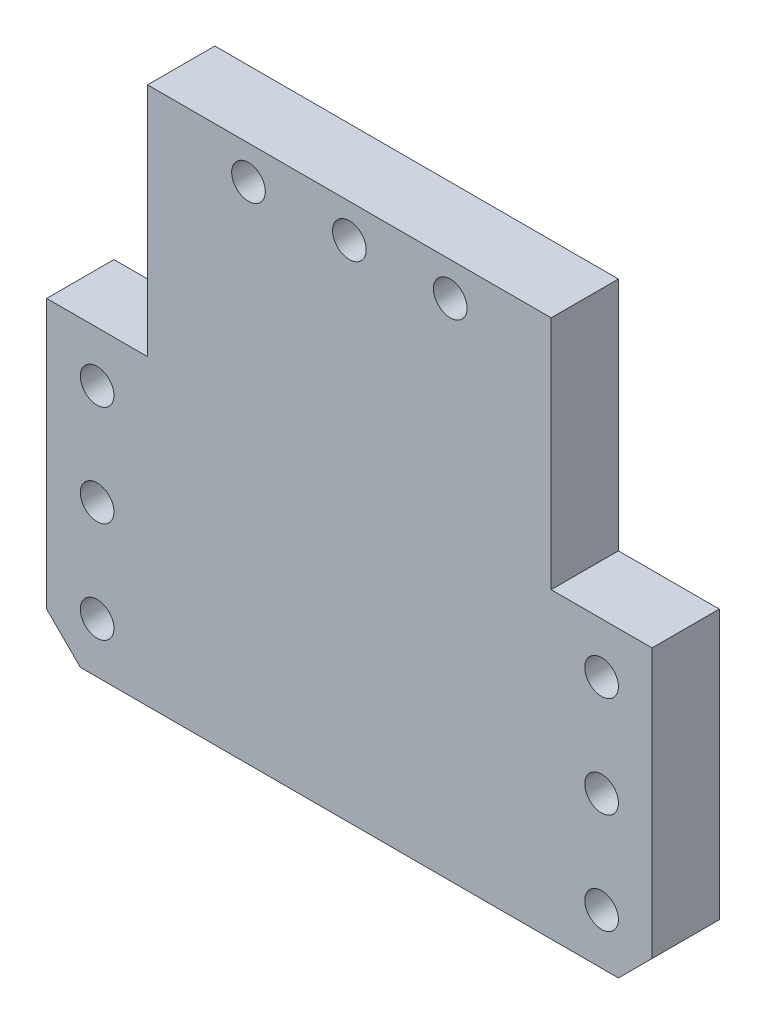
ISO-10303-21;
HEADER;
FILE_DESCRIPTION(('STEP AP214'),'2;1');
FILE_NAME('part.step','',(''),(''),'','','');
FILE_SCHEMA(('AUTOMOTIVE_DESIGN { 1 0 10303 214 1 1 1 1 }'));
ENDSEC;
DATA;
#1=APPLICATION_CONTEXT('core data for automotive mechanical design processes');
#2=APPLICATION_PROTOCOL_DEFINITION('international standard','automotive_design',2000,#1);
#3=PRODUCT_CONTEXT('',#1,'mechanical');
#4=PRODUCT('Part','Part','',(#3));
#5=PRODUCT_RELATED_PRODUCT_CATEGORY('part','',(#4));
#6=PRODUCT_DEFINITION_FORMATION('','',#4);
#7=PRODUCT_DEFINITION_CONTEXT('part definition',#1,'design');
#8=PRODUCT_DEFINITION('design','',#6,#7);
#9=PRODUCT_DEFINITION_SHAPE('','',#8);
#10=(LENGTH_UNIT() NAMED_UNIT(*) SI_UNIT(.MILLI.,.METRE.));
#11=(NAMED_UNIT(*) PLANE_ANGLE_UNIT() SI_UNIT($,.RADIAN.));
#12=(NAMED_UNIT(*) SI_UNIT($,.STERADIAN.) SOLID_ANGLE_UNIT());
#13=UNCERTAINTY_MEASURE_WITH_UNIT(LENGTH_MEASURE(1.E-05),#10,'distance_accuracy_value','');
#14=(GEOMETRIC_REPRESENTATION_CONTEXT(3) GLOBAL_UNCERTAINTY_ASSIGNED_CONTEXT((#13)) GLOBAL_UNIT_ASSIGNED_CONTEXT((#10,
#11,#12)) REPRESENTATION_CONTEXT('',''));
#15=CARTESIAN_POINT('',(0.,0.,0.));
#16=DIRECTION('',(0.,0.,1.));
#17=DIRECTION('',(1.,0.,0.));
#18=AXIS2_PLACEMENT_3D('',#15,#16,#17);
#19=CARTESIAN_POINT('',(60.,0.,10.));
#20=DIRECTION('',(-1.,0.,0.));
#21=DIRECTION('',(0.,0.,1.));
#22=AXIS2_PLACEMENT_3D('',#19,#20,#21);
#23=PLANE('',#22);
#24=DIRECTION('',(0.,0.,1.));
#25=VECTOR('',#24,1.);
#26=CARTESIAN_POINT('',(60.,45.,0.));
#27=LINE('',#26,#25);
#28=CARTESIAN_POINT('',(60.,45.,0.));
#29=VERTEX_POINT('',#28);
#30=CARTESIAN_POINT('',(60.,45.,10.));
#31=VERTEX_POINT('',#30);
#32=EDGE_CURVE('E126',#29,#31,#27,.T.);
#33=ORIENTED_EDGE('',*,*,#32,.F.);
#34=DIRECTION('',(0.,1.,0.));
#35=VECTOR('',#34,1.);
#36=CARTESIAN_POINT('',(60.,0.,0.));
#37=LINE('',#36,#35);
#38=CARTESIAN_POINT('',(60.,80.,0.));
#39=VERTEX_POINT('',#38);
#40=EDGE_CURVE('E131',#29,#39,#37,.T.);
#41=ORIENTED_EDGE('',*,*,#40,.T.);
#42=DIRECTION('',(0.,0.,-1.));
#43=VECTOR('',#42,1.);
#44=CARTESIAN_POINT('',(60.,80.,10.));
#45=LINE('',#44,#43);
#46=CARTESIAN_POINT('',(60.,80.,10.));
#47=VERTEX_POINT('',#46);
#48=EDGE_CURVE('E178',#47,#39,#45,.T.);
#49=ORIENTED_EDGE('',*,*,#48,.F.);
#50=DIRECTION('',(0.,1.,0.));
#51=VECTOR('',#50,1.);
#52=CARTESIAN_POINT('',(60.,0.,10.));
#53=LINE('',#52,#51);
#54=EDGE_CURVE('E164',#31,#47,#53,.T.);
#55=ORIENTED_EDGE('',*,*,#54,.F.);
#56=EDGE_LOOP('',(#33,#41,#49,#55));
#57=FACE_BOUND('',#56,.T.);
#58=ADVANCED_FACE('F33',(#57),#23,.F.);
#59=CARTESIAN_POINT('',(0.,0.,10.));
#60=DIRECTION('',(1.,0.,0.));
#61=DIRECTION('',(0.,0.,-1.));
#62=AXIS2_PLACEMENT_3D('',#59,#60,#61);
#63=PLANE('',#62);
#64=DIRECTION('',(0.,-1.,0.));
#65=VECTOR('',#64,1.);
#66=CARTESIAN_POINT('',(0.,0.,0.));
#67=LINE('',#66,#65);
#68=CARTESIAN_POINT('',(0.,80.,0.));
#69=VERTEX_POINT('',#68);
#70=CARTESIAN_POINT('',(0.,45.,0.));
#71=VERTEX_POINT('',#70);
#72=EDGE_CURVE('E154',#69,#71,#67,.T.);
#73=ORIENTED_EDGE('',*,*,#72,.T.);
#74=DIRECTION('',(0.,0.,1.));
#75=VECTOR('',#74,1.);
#76=CARTESIAN_POINT('',(0.,45.,0.));
#77=LINE('',#76,#75);
#78=CARTESIAN_POINT('',(0.,45.,10.));
#79=VERTEX_POINT('',#78);
#80=EDGE_CURVE('E147',#71,#79,#77,.T.);
#81=ORIENTED_EDGE('',*,*,#80,.T.);
#82=DIRECTION('',(0.,-1.,0.));
#83=VECTOR('',#82,1.);
#84=CARTESIAN_POINT('',(0.,0.,10.));
#85=LINE('',#84,#83);
#86=CARTESIAN_POINT('',(0.,80.,10.));
#87=VERTEX_POINT('',#86);
#88=EDGE_CURVE('E157',#87,#79,#85,.T.);
#89=ORIENTED_EDGE('',*,*,#88,.F.);
#90=DIRECTION('',(0.,0.,-1.));
#91=VECTOR('',#90,1.);
#92=CARTESIAN_POINT('',(0.,80.,10.));
#93=LINE('',#92,#91);
#94=EDGE_CURVE('E168',#87,#69,#93,.T.);
#95=ORIENTED_EDGE('',*,*,#94,.T.);
#96=EDGE_LOOP('',(#73,#81,#89,#95));
#97=FACE_BOUND('',#96,.T.);
#98=ADVANCED_FACE('F210',(#97),#63,.F.);
#99=CARTESIAN_POINT('',(0.,0.,10.));
#100=DIRECTION('',(0.,1.,0.));
#101=DIRECTION('',(0.,0.,1.));
#102=AXIS2_PLACEMENT_3D('',#99,#100,#101);
#103=PLANE('',#102);
#104=DIRECTION('',(1.,0.,0.));
#105=VECTOR('',#104,1.);
#106=CARTESIAN_POINT('',(0.,0.,0.));
#107=LINE('',#106,#105);
#108=CARTESIAN_POINT('',(-9.99999999999999,0.,0.));
#109=VERTEX_POINT('',#108);
#110=CARTESIAN_POINT('',(70.,0.,0.));
#111=VERTEX_POINT('',#110);
#112=EDGE_CURVE('E171',#109,#111,#107,.T.);
#113=ORIENTED_EDGE('',*,*,#112,.T.);
#114=DIRECTION('',(0.,0.,1.));
#115=VECTOR('',#114,1.);
#116=CARTESIAN_POINT('',(70.,0.,10.));
#117=LINE('',#116,#115);
#118=CARTESIAN_POINT('',(70.,0.,10.));
#119=VERTEX_POINT('',#118);
#120=EDGE_CURVE('E183',#111,#119,#117,.T.);
#121=ORIENTED_EDGE('',*,*,#120,.T.);
#122=DIRECTION('',(1.,0.,0.));
#123=VECTOR('',#122,1.);
#124=CARTESIAN_POINT('',(0.,0.,10.));
#125=LINE('',#124,#123);
#126=CARTESIAN_POINT('',(-9.99999999999999,0.,10.));
#127=VERTEX_POINT('',#126);
#128=EDGE_CURVE('E160',#127,#119,#125,.T.);
#129=ORIENTED_EDGE('',*,*,#128,.F.);
#130=DIRECTION('',(0.,0.,-1.));
#131=VECTOR('',#130,1.);
#132=CARTESIAN_POINT('',(-9.99999999999999,0.,0.));
#133=LINE('',#132,#131);
#134=EDGE_CURVE('E181',#127,#109,#133,.T.);
#135=ORIENTED_EDGE('',*,*,#134,.T.);
#136=EDGE_LOOP('',(#113,#121,#129,#135));
#137=FACE_BOUND('',#136,.T.);
#138=ADVANCED_FACE('F194',(#137),#103,.F.);
#139=CARTESIAN_POINT('',(0.,80.,10.));
#140=DIRECTION('',(0.,-1.,0.));
#141=DIRECTION('',(0.,0.,-1.));
#142=AXIS2_PLACEMENT_3D('',#139,#140,#141);
#143=PLANE('',#142);
#144=DIRECTION('',(-1.,0.,0.));
#145=VECTOR('',#144,1.);
#146=CARTESIAN_POINT('',(0.,80.,0.));
#147=LINE('',#146,#145);
#148=EDGE_CURVE('E161',#39,#69,#147,.T.);
#149=ORIENTED_EDGE('',*,*,#148,.T.);
#150=ORIENTED_EDGE('',*,*,#94,.F.);
#151=DIRECTION('',(-1.,0.,0.));
#152=VECTOR('',#151,1.);
#153=CARTESIAN_POINT('',(0.,80.,10.));
#154=LINE('',#153,#152);
#155=EDGE_CURVE('E166',#47,#87,#154,.T.);
#156=ORIENTED_EDGE('',*,*,#155,.F.);
#157=ORIENTED_EDGE('',*,*,#48,.T.);
#158=EDGE_LOOP('',(#149,#150,#156,#157));
#159=FACE_BOUND('',#158,.T.);
#160=ADVANCED_FACE('F214',(#159),#143,.F.);
#161=CARTESIAN_POINT('',(0.,0.,10.));
#162=DIRECTION('',(0.,0.,-1.));
#163=DIRECTION('',(-1.,0.,0.));
#164=AXIS2_PLACEMENT_3D('',#161,#162,#163);
#165=PLANE('',#164);
#166=CARTESIAN_POINT('',(67.5,22.5,10.));
#167=DIRECTION('',(0.,0.,1.));
#168=DIRECTION('',(-1.,0.,0.));
#169=AXIS2_PLACEMENT_3D('',#166,#167,#168);
#170=CIRCLE('',#169,2.50000000000001);
#171=CARTESIAN_POINT('',(65.,22.5,10.));
#172=VERTEX_POINT('',#171);
#173=EDGE_CURVE('E336',#172,#172,#170,.T.);
#174=ORIENTED_EDGE('',*,*,#173,.F.);
#175=EDGE_LOOP('',(#174));
#176=FACE_BOUND('',#175,.T.);
#177=CARTESIAN_POINT('',(67.5,37.5,10.));
#178=DIRECTION('',(0.,0.,1.));
#179=DIRECTION('',(-1.,0.,0.));
#180=AXIS2_PLACEMENT_3D('',#177,#178,#179);
#181=CIRCLE('',#180,2.5);
#182=CARTESIAN_POINT('',(65.,37.5,10.));
#183=VERTEX_POINT('',#182);
#184=EDGE_CURVE('E340',#183,#183,#181,.T.);
#185=ORIENTED_EDGE('',*,*,#184,.F.);
#186=EDGE_LOOP('',(#185));
#187=FACE_BOUND('',#186,.T.);
#188=CARTESIAN_POINT('',(67.5,7.50000000000002,10.));
#189=DIRECTION('',(0.,0.,1.));
#190=DIRECTION('',(1.,0.,0.));
#191=AXIS2_PLACEMENT_3D('',#188,#189,#190);
#192=CIRCLE('',#191,2.50000000000001);
#193=CARTESIAN_POINT('',(70.,7.50000000000002,10.));
#194=VERTEX_POINT('',#193);
#195=EDGE_CURVE('E344',#194,#194,#192,.T.);
#196=ORIENTED_EDGE('',*,*,#195,.F.);
#197=EDGE_LOOP('',(#196));
#198=FACE_BOUND('',#197,.T.);
#199=CARTESIAN_POINT('',(-7.5,7.5,10.));
#200=DIRECTION('',(0.,0.,1.));
#201=DIRECTION('',(-1.,0.,0.));
#202=AXIS2_PLACEMENT_3D('',#199,#200,#201);
#203=CIRCLE('',#202,2.5);
#204=CARTESIAN_POINT('',(-10.,7.5,10.));
#205=VERTEX_POINT('',#204);
#206=EDGE_CURVE('E348',#205,#205,#203,.T.);
#207=ORIENTED_EDGE('',*,*,#206,.F.);
#208=EDGE_LOOP('',(#207));
#209=FACE_BOUND('',#208,.T.);
#210=CARTESIAN_POINT('',(-7.5,37.5,10.));
#211=DIRECTION('',(0.,0.,1.));
#212=DIRECTION('',(1.,0.,0.));
#213=AXIS2_PLACEMENT_3D('',#210,#211,#212);
#214=CIRCLE('',#213,2.5);
#215=CARTESIAN_POINT('',(-5.,37.5,10.));
#216=VERTEX_POINT('',#215);
#217=EDGE_CURVE('E320',#216,#216,#214,.T.);
#218=ORIENTED_EDGE('',*,*,#217,.F.);
#219=EDGE_LOOP('',(#218));
#220=FACE_BOUND('',#219,.T.);
#221=CARTESIAN_POINT('',(-7.5,22.5,10.));
#222=DIRECTION('',(0.,0.,1.));
#223=DIRECTION('',(1.,0.,0.));
#224=AXIS2_PLACEMENT_3D('',#221,#222,#223);
#225=CIRCLE('',#224,2.5);
#226=CARTESIAN_POINT('',(-5.,22.5,10.));
#227=VERTEX_POINT('',#226);
#228=EDGE_CURVE('E324',#227,#227,#225,.T.);
#229=ORIENTED_EDGE('',*,*,#228,.F.);
#230=EDGE_LOOP('',(#229));
#231=FACE_BOUND('',#230,.T.);
#232=CARTESIAN_POINT('',(15.,75.,10.));
#233=DIRECTION('',(0.,0.,1.));
#234=DIRECTION('',(-1.,0.,0.));
#235=AXIS2_PLACEMENT_3D('',#232,#233,#234);
#236=CIRCLE('',#235,2.5);
#237=CARTESIAN_POINT('',(12.5,75.,10.));
#238=VERTEX_POINT('',#237);
#239=EDGE_CURVE('E328',#238,#238,#236,.T.);
#240=ORIENTED_EDGE('',*,*,#239,.F.);
#241=EDGE_LOOP('',(#240));
#242=FACE_BOUND('',#241,.T.);
#243=CARTESIAN_POINT('',(30.,75.,10.));
#244=DIRECTION('',(0.,0.,1.));
#245=DIRECTION('',(1.,0.,0.));
#246=AXIS2_PLACEMENT_3D('',#243,#244,#245);
#247=CIRCLE('',#246,2.5);
#248=CARTESIAN_POINT('',(32.5,75.,10.));
#249=VERTEX_POINT('',#248);
#250=EDGE_CURVE('E332',#249,#249,#247,.T.);
#251=ORIENTED_EDGE('',*,*,#250,.F.);
#252=EDGE_LOOP('',(#251));
#253=FACE_BOUND('',#252,.T.);
#254=CARTESIAN_POINT('',(45.,75.,10.));
#255=DIRECTION('',(0.,0.,1.));
#256=DIRECTION('',(1.,0.,0.));
#257=AXIS2_PLACEMENT_3D('',#254,#255,#256);
#258=CIRCLE('',#257,2.5);
#259=CARTESIAN_POINT('',(47.5,75.,10.));
#260=VERTEX_POINT('',#259);
#261=EDGE_CURVE('E316',#260,#260,#258,.T.);
#262=ORIENTED_EDGE('',*,*,#261,.F.);
#263=EDGE_LOOP('',(#262));
#264=FACE_BOUND('',#263,.T.);
#265=ORIENTED_EDGE('',*,*,#128,.T.);
#266=DIRECTION('',(0.707106781186548,0.707106781186548,0.));
#267=VECTOR('',#266,1.);
#268=CARTESIAN_POINT('',(70.,0.,10.));
#269=LINE('',#268,#267);
#270=CARTESIAN_POINT('',(75.,5.,10.));
#271=VERTEX_POINT('',#270);
#272=EDGE_CURVE('E188',#119,#271,#269,.T.);
#273=ORIENTED_EDGE('',*,*,#272,.T.);
#274=DIRECTION('',(0.,1.,0.));
#275=VECTOR('',#274,1.);
#276=CARTESIAN_POINT('',(75.,0.,10.));
#277=LINE('',#276,#275);
#278=CARTESIAN_POINT('',(75.,45.,10.));
#279=VERTEX_POINT('',#278);
#280=EDGE_CURVE('E135',#271,#279,#277,.T.);
#281=ORIENTED_EDGE('',*,*,#280,.T.);
#282=DIRECTION('',(-1.,0.,0.));
#283=VECTOR('',#282,1.);
#284=CARTESIAN_POINT('',(60.,45.,10.));
#285=LINE('',#284,#283);
#286=EDGE_CURVE('E119',#279,#31,#285,.T.);
#287=ORIENTED_EDGE('',*,*,#286,.T.);
#288=ORIENTED_EDGE('',*,*,#54,.T.);
#289=ORIENTED_EDGE('',*,*,#155,.T.);
#290=ORIENTED_EDGE('',*,*,#88,.T.);
#291=DIRECTION('',(-1.,0.,0.));
#292=VECTOR('',#291,1.);
#293=CARTESIAN_POINT('',(0.,45.,10.));
#294=LINE('',#293,#292);
#295=CARTESIAN_POINT('',(-15.,45.,10.));
#296=VERTEX_POINT('',#295);
#297=EDGE_CURVE('E139',#79,#296,#294,.T.);
#298=ORIENTED_EDGE('',*,*,#297,.T.);
#299=DIRECTION('',(0.,-1.,0.));
#300=VECTOR('',#299,1.);
#301=CARTESIAN_POINT('',(-15.,0.,10.));
#302=LINE('',#301,#300);
#303=CARTESIAN_POINT('',(-15.,5.,10.));
#304=VERTEX_POINT('',#303);
#305=EDGE_CURVE('E145',#296,#304,#302,.T.);
#306=ORIENTED_EDGE('',*,*,#305,.T.);
#307=DIRECTION('',(0.707106781186548,-0.707106781186548,0.));
#308=VECTOR('',#307,1.);
#309=CARTESIAN_POINT('',(-15.,5.,10.));
#310=LINE('',#309,#308);
#311=EDGE_CURVE('E186',#304,#127,#310,.T.);
#312=ORIENTED_EDGE('',*,*,#311,.T.);
#313=EDGE_LOOP('',(#265,#273,#281,#287,#288,#289,#290,#298,#306,#312));
#314=FACE_BOUND('',#313,.T.);
#315=ADVANCED_FACE('F199',(#176,#187,#198,#209,#220,#231,#242,#253,#264,#314),#165,.F.);
#316=CARTESIAN_POINT('',(0.,0.,0.));
#317=DIRECTION('',(0.,0.,-1.));
#318=DIRECTION('',(-1.,0.,0.));
#319=AXIS2_PLACEMENT_3D('',#316,#317,#318);
#320=PLANE('',#319);
#321=CARTESIAN_POINT('',(67.5,22.5,0.));
#322=DIRECTION('',(0.,0.,1.));
#323=DIRECTION('',(-1.,0.,0.));
#324=AXIS2_PLACEMENT_3D('',#321,#322,#323);
#325=CIRCLE('',#324,2.50000000000001);
#326=CARTESIAN_POINT('',(65.,22.5,0.));
#327=VERTEX_POINT('',#326);
#328=EDGE_CURVE('E285',#327,#327,#325,.T.);
#329=ORIENTED_EDGE('',*,*,#328,.T.);
#330=EDGE_LOOP('',(#329));
#331=FACE_BOUND('',#330,.T.);
#332=CARTESIAN_POINT('',(67.5,37.5,0.));
#333=DIRECTION('',(0.,0.,1.));
#334=DIRECTION('',(-1.,0.,0.));
#335=AXIS2_PLACEMENT_3D('',#332,#333,#334);
#336=CIRCLE('',#335,2.5);
#337=CARTESIAN_POINT('',(65.,37.5,0.));
#338=VERTEX_POINT('',#337);
#339=EDGE_CURVE('E289',#338,#338,#336,.T.);
#340=ORIENTED_EDGE('',*,*,#339,.T.);
#341=EDGE_LOOP('',(#340));
#342=FACE_BOUND('',#341,.T.);
#343=CARTESIAN_POINT('',(67.5,7.50000000000002,0.));
#344=DIRECTION('',(0.,0.,1.));
#345=DIRECTION('',(1.,0.,0.));
#346=AXIS2_PLACEMENT_3D('',#343,#344,#345);
#347=CIRCLE('',#346,2.50000000000001);
#348=CARTESIAN_POINT('',(70.,7.50000000000002,0.));
#349=VERTEX_POINT('',#348);
#350=EDGE_CURVE('E293',#349,#349,#347,.T.);
#351=ORIENTED_EDGE('',*,*,#350,.T.);
#352=EDGE_LOOP('',(#351));
#353=FACE_BOUND('',#352,.T.);
#354=CARTESIAN_POINT('',(-7.5,7.5,0.));
#355=DIRECTION('',(0.,0.,1.));
#356=DIRECTION('',(-1.,0.,0.));
#357=AXIS2_PLACEMENT_3D('',#354,#355,#356);
#358=CIRCLE('',#357,2.5);
#359=CARTESIAN_POINT('',(-10.,7.5,0.));
#360=VERTEX_POINT('',#359);
#361=EDGE_CURVE('E297',#360,#360,#358,.T.);
#362=ORIENTED_EDGE('',*,*,#361,.T.);
#363=EDGE_LOOP('',(#362));
#364=FACE_BOUND('',#363,.T.);
#365=CARTESIAN_POINT('',(-7.5,37.5,0.));
#366=DIRECTION('',(0.,0.,1.));
#367=DIRECTION('',(1.,0.,0.));
#368=AXIS2_PLACEMENT_3D('',#365,#366,#367);
#369=CIRCLE('',#368,2.5);
#370=CARTESIAN_POINT('',(-5.,37.5,0.));
#371=VERTEX_POINT('',#370);
#372=EDGE_CURVE('E301',#371,#371,#369,.T.);
#373=ORIENTED_EDGE('',*,*,#372,.T.);
#374=EDGE_LOOP('',(#373));
#375=FACE_BOUND('',#374,.T.);
#376=CARTESIAN_POINT('',(-7.5,22.5,0.));
#377=DIRECTION('',(0.,0.,1.));
#378=DIRECTION('',(1.,0.,0.));
#379=AXIS2_PLACEMENT_3D('',#376,#377,#378);
#380=CIRCLE('',#379,2.5);
#381=CARTESIAN_POINT('',(-5.,22.5,0.));
#382=VERTEX_POINT('',#381);
#383=EDGE_CURVE('E305',#382,#382,#380,.T.);
#384=ORIENTED_EDGE('',*,*,#383,.T.);
#385=EDGE_LOOP('',(#384));
#386=FACE_BOUND('',#385,.T.);
#387=CARTESIAN_POINT('',(15.,75.,0.));
#388=DIRECTION('',(0.,0.,1.));
#389=DIRECTION('',(-1.,0.,0.));
#390=AXIS2_PLACEMENT_3D('',#387,#388,#389);
#391=CIRCLE('',#390,2.5);
#392=CARTESIAN_POINT('',(12.5,75.,0.));
#393=VERTEX_POINT('',#392);
#394=EDGE_CURVE('E309',#393,#393,#391,.T.);
#395=ORIENTED_EDGE('',*,*,#394,.T.);
#396=EDGE_LOOP('',(#395));
#397=FACE_BOUND('',#396,.T.);
#398=CARTESIAN_POINT('',(30.,75.,0.));
#399=DIRECTION('',(0.,0.,1.));
#400=DIRECTION('',(1.,0.,0.));
#401=AXIS2_PLACEMENT_3D('',#398,#399,#400);
#402=CIRCLE('',#401,2.5);
#403=CARTESIAN_POINT('',(32.5,75.,0.));
#404=VERTEX_POINT('',#403);
#405=EDGE_CURVE('E313',#404,#404,#402,.T.);
#406=ORIENTED_EDGE('',*,*,#405,.T.);
#407=EDGE_LOOP('',(#406));
#408=FACE_BOUND('',#407,.T.);
#409=CARTESIAN_POINT('',(45.,75.,0.));
#410=DIRECTION('',(0.,0.,1.));
#411=DIRECTION('',(1.,0.,0.));
#412=AXIS2_PLACEMENT_3D('',#409,#410,#411);
#413=CIRCLE('',#412,2.5);
#414=CARTESIAN_POINT('',(47.5,75.,0.));
#415=VERTEX_POINT('',#414);
#416=EDGE_CURVE('E137',#415,#415,#413,.T.);
#417=ORIENTED_EDGE('',*,*,#416,.T.);
#418=EDGE_LOOP('',(#417));
#419=FACE_BOUND('',#418,.T.);
#420=DIRECTION('',(0.,1.,0.));
#421=VECTOR('',#420,1.);
#422=CARTESIAN_POINT('',(75.,0.,0.));
#423=LINE('',#422,#421);
#424=CARTESIAN_POINT('',(75.,5.,0.));
#425=VERTEX_POINT('',#424);
#426=CARTESIAN_POINT('',(75.,45.,0.));
#427=VERTEX_POINT('',#426);
#428=EDGE_CURVE('E111',#425,#427,#423,.T.);
#429=ORIENTED_EDGE('',*,*,#428,.F.);
#430=DIRECTION('',(-0.707106781186548,-0.707106781186548,0.));
#431=VECTOR('',#430,1.);
#432=CARTESIAN_POINT('',(35.,-35.,0.));
#433=LINE('',#432,#431);
#434=EDGE_CURVE('E41',#425,#111,#433,.T.);
#435=ORIENTED_EDGE('',*,*,#434,.T.);
#436=ORIENTED_EDGE('',*,*,#112,.F.);
#437=DIRECTION('',(-0.707106781186548,0.707106781186548,0.));
#438=VECTOR('',#437,1.);
#439=CARTESIAN_POINT('',(-5.,-5.,0.));
#440=LINE('',#439,#438);
#441=CARTESIAN_POINT('',(-15.,5.,0.));
#442=VERTEX_POINT('',#441);
#443=EDGE_CURVE('E48',#109,#442,#440,.T.);
#444=ORIENTED_EDGE('',*,*,#443,.T.);
#445=DIRECTION('',(0.,-1.,0.));
#446=VECTOR('',#445,1.);
#447=CARTESIAN_POINT('',(-15.,0.,0.));
#448=LINE('',#447,#446);
#449=CARTESIAN_POINT('',(-15.,45.,0.));
#450=VERTEX_POINT('',#449);
#451=EDGE_CURVE('E144',#450,#442,#448,.T.);
#452=ORIENTED_EDGE('',*,*,#451,.F.);
#453=DIRECTION('',(-1.,0.,0.));
#454=VECTOR('',#453,1.);
#455=CARTESIAN_POINT('',(0.,45.,0.));
#456=LINE('',#455,#454);
#457=EDGE_CURVE('E141',#71,#450,#456,.T.);
#458=ORIENTED_EDGE('',*,*,#457,.F.);
#459=ORIENTED_EDGE('',*,*,#72,.F.);
#460=ORIENTED_EDGE('',*,*,#148,.F.);
#461=ORIENTED_EDGE('',*,*,#40,.F.);
#462=DIRECTION('',(-1.,0.,0.));
#463=VECTOR('',#462,1.);
#464=CARTESIAN_POINT('',(60.,45.,0.));
#465=LINE('',#464,#463);
#466=EDGE_CURVE('E118',#427,#29,#465,.T.);
#467=ORIENTED_EDGE('',*,*,#466,.F.);
#468=EDGE_LOOP('',(#429,#435,#436,#444,#452,#458,#459,#460,#461,#467));
#469=FACE_BOUND('',#468,.T.);
#470=ADVANCED_FACE('F129',(#331,#342,#353,#364,#375,#386,#397,#408,#419,#469),#320,.T.);
#471=CARTESIAN_POINT('',(-15.,0.,0.));
#472=DIRECTION('',(-1.,0.,0.));
#473=DIRECTION('',(0.,0.,1.));
#474=AXIS2_PLACEMENT_3D('',#471,#472,#473);
#475=PLANE('',#474);
#476=ORIENTED_EDGE('',*,*,#451,.T.);
#477=DIRECTION('',(0.,0.,1.));
#478=VECTOR('',#477,1.);
#479=CARTESIAN_POINT('',(-15.,5.,10.));
#480=LINE('',#479,#478);
#481=EDGE_CURVE('E11',#442,#304,#480,.T.);
#482=ORIENTED_EDGE('',*,*,#481,.T.);
#483=ORIENTED_EDGE('',*,*,#305,.F.);
#484=DIRECTION('',(0.,0.,1.));
#485=VECTOR('',#484,1.);
#486=CARTESIAN_POINT('',(-15.,45.,0.));
#487=LINE('',#486,#485);
#488=EDGE_CURVE('E152',#450,#296,#487,.T.);
#489=ORIENTED_EDGE('',*,*,#488,.F.);
#490=EDGE_LOOP('',(#476,#482,#483,#489));
#491=FACE_BOUND('',#490,.T.);
#492=ADVANCED_FACE('F204',(#491),#475,.T.);
#493=CARTESIAN_POINT('',(0.,45.,0.));
#494=DIRECTION('',(0.,1.,0.));
#495=DIRECTION('',(0.,0.,1.));
#496=AXIS2_PLACEMENT_3D('',#493,#494,#495);
#497=PLANE('',#496);
#498=ORIENTED_EDGE('',*,*,#297,.F.);
#499=ORIENTED_EDGE('',*,*,#80,.F.);
#500=ORIENTED_EDGE('',*,*,#457,.T.);
#501=ORIENTED_EDGE('',*,*,#488,.T.);
#502=EDGE_LOOP('',(#498,#499,#500,#501));
#503=FACE_BOUND('',#502,.T.);
#504=ADVANCED_FACE('F207',(#503),#497,.T.);
#505=CARTESIAN_POINT('',(60.,45.,0.));
#506=DIRECTION('',(0.,1.,0.));
#507=DIRECTION('',(0.,0.,1.));
#508=AXIS2_PLACEMENT_3D('',#505,#506,#507);
#509=PLANE('',#508);
#510=ORIENTED_EDGE('',*,*,#286,.F.);
#511=DIRECTION('',(0.,0.,1.));
#512=VECTOR('',#511,1.);
#513=CARTESIAN_POINT('',(75.,45.,0.));
#514=LINE('',#513,#512);
#515=EDGE_CURVE('E114',#427,#279,#514,.T.);
#516=ORIENTED_EDGE('',*,*,#515,.F.);
#517=ORIENTED_EDGE('',*,*,#466,.T.);
#518=ORIENTED_EDGE('',*,*,#32,.T.);
#519=EDGE_LOOP('',(#510,#516,#517,#518));
#520=FACE_BOUND('',#519,.T.);
#521=ADVANCED_FACE('F123',(#520),#509,.T.);
#522=CARTESIAN_POINT('',(75.,0.,0.));
#523=DIRECTION('',(1.,0.,0.));
#524=DIRECTION('',(0.,0.,-1.));
#525=AXIS2_PLACEMENT_3D('',#522,#523,#524);
#526=PLANE('',#525);
#527=ORIENTED_EDGE('',*,*,#280,.F.);
#528=DIRECTION('',(0.,0.,-1.));
#529=VECTOR('',#528,1.);
#530=CARTESIAN_POINT('',(75.,5.,0.));
#531=LINE('',#530,#529);
#532=EDGE_CURVE('E56',#271,#425,#531,.T.);
#533=ORIENTED_EDGE('',*,*,#532,.T.);
#534=ORIENTED_EDGE('',*,*,#428,.T.);
#535=ORIENTED_EDGE('',*,*,#515,.T.);
#536=EDGE_LOOP('',(#527,#533,#534,#535));
#537=FACE_BOUND('',#536,.T.);
#538=ADVANCED_FACE('F113',(#537),#526,.T.);
#539=CARTESIAN_POINT('',(45.,75.,0.));
#540=DIRECTION('',(0.,0.,1.));
#541=DIRECTION('',(1.,0.,0.));
#542=AXIS2_PLACEMENT_3D('',#539,#540,#541);
#543=CYLINDRICAL_SURFACE('',#542,2.5);
#544=ORIENTED_EDGE('',*,*,#416,.F.);
#545=EDGE_LOOP('',(#544));
#546=FACE_BOUND('',#545,.T.);
#547=ORIENTED_EDGE('',*,*,#261,.T.);
#548=EDGE_LOOP('',(#547));
#549=FACE_BOUND('',#548,.T.);
#550=ADVANCED_FACE('F252',(#546,#549),#543,.F.);
#551=CARTESIAN_POINT('',(30.,75.,0.));
#552=DIRECTION('',(0.,0.,1.));
#553=DIRECTION('',(1.,0.,0.));
#554=AXIS2_PLACEMENT_3D('',#551,#552,#553);
#555=CYLINDRICAL_SURFACE('',#554,2.5);
#556=ORIENTED_EDGE('',*,*,#405,.F.);
#557=EDGE_LOOP('',(#556));
#558=FACE_BOUND('',#557,.T.);
#559=ORIENTED_EDGE('',*,*,#250,.T.);
#560=EDGE_LOOP('',(#559));
#561=FACE_BOUND('',#560,.T.);
#562=ADVANCED_FACE('F248',(#558,#561),#555,.F.);
#563=CARTESIAN_POINT('',(15.,75.,0.));
#564=DIRECTION('',(0.,0.,1.));
#565=DIRECTION('',(1.,0.,0.));
#566=AXIS2_PLACEMENT_3D('',#563,#564,#565);
#567=CYLINDRICAL_SURFACE('',#566,2.5);
#568=ORIENTED_EDGE('',*,*,#394,.F.);
#569=EDGE_LOOP('',(#568));
#570=FACE_BOUND('',#569,.T.);
#571=ORIENTED_EDGE('',*,*,#239,.T.);
#572=EDGE_LOOP('',(#571));
#573=FACE_BOUND('',#572,.T.);
#574=ADVANCED_FACE('F251',(#570,#573),#567,.F.);
#575=CARTESIAN_POINT('',(-7.5,22.5,0.));
#576=DIRECTION('',(0.,0.,1.));
#577=DIRECTION('',(1.,0.,0.));
#578=AXIS2_PLACEMENT_3D('',#575,#576,#577);
#579=CYLINDRICAL_SURFACE('',#578,2.5);
#580=ORIENTED_EDGE('',*,*,#383,.F.);
#581=EDGE_LOOP('',(#580));
#582=FACE_BOUND('',#581,.T.);
#583=ORIENTED_EDGE('',*,*,#228,.T.);
#584=EDGE_LOOP('',(#583));
#585=FACE_BOUND('',#584,.T.);
#586=ADVANCED_FACE('F256',(#582,#585),#579,.F.);
#587=CARTESIAN_POINT('',(-7.5,37.5,0.));
#588=DIRECTION('',(0.,0.,1.));
#589=DIRECTION('',(1.,0.,0.));
#590=AXIS2_PLACEMENT_3D('',#587,#588,#589);
#591=CYLINDRICAL_SURFACE('',#590,2.5);
#592=ORIENTED_EDGE('',*,*,#372,.F.);
#593=EDGE_LOOP('',(#592));
#594=FACE_BOUND('',#593,.T.);
#595=ORIENTED_EDGE('',*,*,#217,.T.);
#596=EDGE_LOOP('',(#595));
#597=FACE_BOUND('',#596,.T.);
#598=ADVANCED_FACE('F260',(#594,#597),#591,.F.);
#599=CARTESIAN_POINT('',(-7.5,7.5,0.));
#600=DIRECTION('',(0.,0.,1.));
#601=DIRECTION('',(1.,0.,0.));
#602=AXIS2_PLACEMENT_3D('',#599,#600,#601);
#603=CYLINDRICAL_SURFACE('',#602,2.5);
#604=ORIENTED_EDGE('',*,*,#361,.F.);
#605=EDGE_LOOP('',(#604));
#606=FACE_BOUND('',#605,.T.);
#607=ORIENTED_EDGE('',*,*,#206,.T.);
#608=EDGE_LOOP('',(#607));
#609=FACE_BOUND('',#608,.T.);
#610=ADVANCED_FACE('F264',(#606,#609),#603,.F.);
#611=CARTESIAN_POINT('',(67.5,7.50000000000002,0.));
#612=DIRECTION('',(0.,0.,1.));
#613=DIRECTION('',(1.,0.,0.));
#614=AXIS2_PLACEMENT_3D('',#611,#612,#613);
#615=CYLINDRICAL_SURFACE('',#614,2.50000000000001);
#616=ORIENTED_EDGE('',*,*,#350,.F.);
#617=EDGE_LOOP('',(#616));
#618=FACE_BOUND('',#617,.T.);
#619=ORIENTED_EDGE('',*,*,#195,.T.);
#620=EDGE_LOOP('',(#619));
#621=FACE_BOUND('',#620,.T.);
#622=ADVANCED_FACE('F241',(#618,#621),#615,.F.);
#623=CARTESIAN_POINT('',(67.5,37.5,0.));
#624=DIRECTION('',(0.,0.,1.));
#625=DIRECTION('',(1.,0.,0.));
#626=AXIS2_PLACEMENT_3D('',#623,#624,#625);
#627=CYLINDRICAL_SURFACE('',#626,2.5);
#628=ORIENTED_EDGE('',*,*,#339,.F.);
#629=EDGE_LOOP('',(#628));
#630=FACE_BOUND('',#629,.T.);
#631=ORIENTED_EDGE('',*,*,#184,.T.);
#632=EDGE_LOOP('',(#631));
#633=FACE_BOUND('',#632,.T.);
#634=ADVANCED_FACE('F235',(#630,#633),#627,.F.);
#635=CARTESIAN_POINT('',(67.5,22.5,0.));
#636=DIRECTION('',(0.,0.,1.));
#637=DIRECTION('',(1.,0.,0.));
#638=AXIS2_PLACEMENT_3D('',#635,#636,#637);
#639=CYLINDRICAL_SURFACE('',#638,2.50000000000001);
#640=ORIENTED_EDGE('',*,*,#328,.F.);
#641=EDGE_LOOP('',(#640));
#642=FACE_BOUND('',#641,.T.);
#643=ORIENTED_EDGE('',*,*,#173,.T.);
#644=EDGE_LOOP('',(#643));
#645=FACE_BOUND('',#644,.T.);
#646=ADVANCED_FACE('F230',(#642,#645),#639,.F.);
#647=CARTESIAN_POINT('',(70.,0.,10.));
#648=DIRECTION('',(0.707106781186547,-0.707106781186547,0.));
#649=DIRECTION('',(0.,0.,-1.));
#650=AXIS2_PLACEMENT_3D('',#647,#648,#649);
#651=PLANE('',#650);
#652=ORIENTED_EDGE('',*,*,#434,.F.);
#653=ORIENTED_EDGE('',*,*,#532,.F.);
#654=ORIENTED_EDGE('',*,*,#272,.F.);
#655=ORIENTED_EDGE('',*,*,#120,.F.);
#656=EDGE_LOOP('',(#652,#653,#654,#655));
#657=FACE_BOUND('',#656,.T.);
#658=ADVANCED_FACE('F197',(#657),#651,.T.);
#659=CARTESIAN_POINT('',(-15.,5.,0.));
#660=DIRECTION('',(-0.707106781186547,-0.707106781186547,0.));
#661=DIRECTION('',(0.,0.,-1.));
#662=AXIS2_PLACEMENT_3D('',#659,#660,#661);
#663=PLANE('',#662);
#664=ORIENTED_EDGE('',*,*,#443,.F.);
#665=ORIENTED_EDGE('',*,*,#134,.F.);
#666=ORIENTED_EDGE('',*,*,#311,.F.);
#667=ORIENTED_EDGE('',*,*,#481,.F.);
#668=EDGE_LOOP('',(#664,#665,#666,#667));
#669=FACE_BOUND('',#668,.T.);
#670=ADVANCED_FACE('F35',(#669),#663,.T.);
#671=CLOSED_SHELL('',(#58,#98,#138,#160,#315,#470,#492,#504,#521,#538,#550,#562,#574,#586,#598,
#610,#622,#634,#646,#658,#670));
#672=MANIFOLD_SOLID_BREP('B2',#671);
#673=ADVANCED_BREP_SHAPE_REPRESENTATION('',(#18,#672),#14);
#674=SHAPE_DEFINITION_REPRESENTATION(#9,#673);
ENDSEC;
END-ISO-10303-21;
